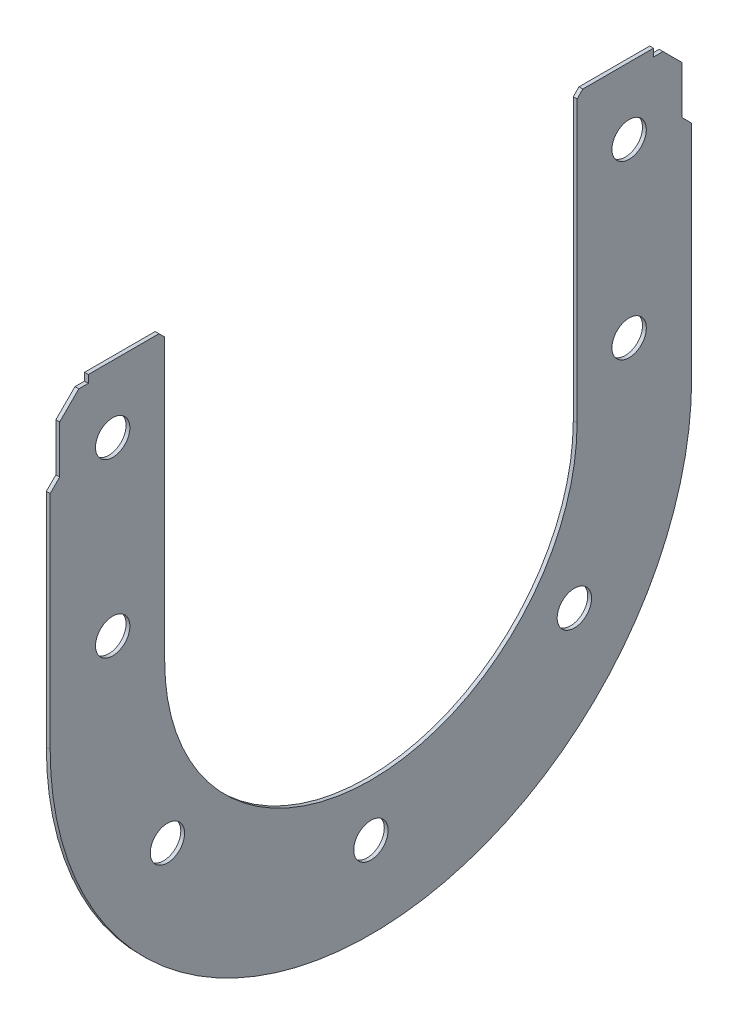
ISO-10303-21;
HEADER;
FILE_DESCRIPTION(('STEP AP214'),'2;1');
FILE_NAME('part.step','',(''),(''),'','','');
FILE_SCHEMA(('AUTOMOTIVE_DESIGN { 1 0 10303 214 1 1 1 1 }'));
ENDSEC;
DATA;
#1=APPLICATION_CONTEXT('core data for automotive mechanical design processes');
#2=APPLICATION_PROTOCOL_DEFINITION('international standard','automotive_design',2000,#1);
#3=PRODUCT_CONTEXT('',#1,'mechanical');
#4=PRODUCT('Part','Part','',(#3));
#5=PRODUCT_RELATED_PRODUCT_CATEGORY('part','',(#4));
#6=PRODUCT_DEFINITION_FORMATION('','',#4);
#7=PRODUCT_DEFINITION_CONTEXT('part definition',#1,'design');
#8=PRODUCT_DEFINITION('design','',#6,#7);
#9=PRODUCT_DEFINITION_SHAPE('','',#8);
#10=(LENGTH_UNIT() NAMED_UNIT(*) SI_UNIT(.MILLI.,.METRE.));
#11=(NAMED_UNIT(*) PLANE_ANGLE_UNIT() SI_UNIT($,.RADIAN.));
#12=(NAMED_UNIT(*) SI_UNIT($,.STERADIAN.) SOLID_ANGLE_UNIT());
#13=UNCERTAINTY_MEASURE_WITH_UNIT(LENGTH_MEASURE(1.E-05),#10,'distance_accuracy_value','');
#14=(GEOMETRIC_REPRESENTATION_CONTEXT(3) GLOBAL_UNCERTAINTY_ASSIGNED_CONTEXT((#13)) GLOBAL_UNIT_ASSIGNED_CONTEXT((#10,
#11,#12)) REPRESENTATION_CONTEXT('',''));
#15=CARTESIAN_POINT('',(0.,0.,0.));
#16=DIRECTION('',(0.,0.,1.));
#17=DIRECTION('',(1.,0.,0.));
#18=AXIS2_PLACEMENT_3D('',#15,#16,#17);
#19=CARTESIAN_POINT('',(-1.,0.,108.));
#20=DIRECTION('',(0.,0.,-1.));
#21=DIRECTION('',(-1.,0.,0.));
#22=AXIS2_PLACEMENT_3D('',#19,#20,#21);
#23=PLANE('',#22);
#24=DIRECTION('',(0.,1.,0.));
#25=VECTOR('',#24,1.);
#26=CARTESIAN_POINT('',(-1.,146.,108.));
#27=LINE('',#26,#25);
#28=CARTESIAN_POINT('',(-1.,0.,108.));
#29=VERTEX_POINT('',#28);
#30=CARTESIAN_POINT('',(-1.,147.,108.));
#31=VERTEX_POINT('',#30);
#32=EDGE_CURVE('E301',#29,#31,#27,.T.);
#33=ORIENTED_EDGE('',*,*,#32,.T.);
#34=DIRECTION('',(1.,0.,0.));
#35=VECTOR('',#34,1.);
#36=CARTESIAN_POINT('',(-1.,147.,108.));
#37=LINE('',#36,#35);
#38=CARTESIAN_POINT('',(1.,147.,108.));
#39=VERTEX_POINT('',#38);
#40=EDGE_CURVE('E59',#31,#39,#37,.T.);
#41=ORIENTED_EDGE('',*,*,#40,.T.);
#42=DIRECTION('',(0.,1.,0.));
#43=VECTOR('',#42,1.);
#44=CARTESIAN_POINT('',(1.,0.,108.));
#45=LINE('',#44,#43);
#46=CARTESIAN_POINT('',(1.,0.,108.));
#47=VERTEX_POINT('',#46);
#48=EDGE_CURVE('E305',#47,#39,#45,.T.);
#49=ORIENTED_EDGE('',*,*,#48,.F.);
#50=DIRECTION('',(1.,0.,0.));
#51=VECTOR('',#50,1.);
#52=CARTESIAN_POINT('',(-1.,0.,108.));
#53=LINE('',#52,#51);
#54=EDGE_CURVE('E386',#29,#47,#53,.T.);
#55=ORIENTED_EDGE('',*,*,#54,.F.);
#56=EDGE_LOOP('',(#33,#41,#49,#55));
#57=FACE_BOUND('',#56,.T.);
#58=ADVANCED_FACE('F49',(#57),#23,.T.);
#59=CARTESIAN_POINT('',(-1.,0.,0.));
#60=DIRECTION('',(1.,0.,0.));
#61=DIRECTION('',(0.,0.,-1.));
#62=AXIS2_PLACEMENT_3D('',#59,#60,#61);
#63=CYLINDRICAL_SURFACE('',#62,108.);
#64=CARTESIAN_POINT('',(1.,0.,0.));
#65=DIRECTION('',(-1.,0.,0.));
#66=DIRECTION('',(0.,0.,-1.));
#67=AXIS2_PLACEMENT_3D('',#64,#65,#66);
#68=CIRCLE('',#67,108.);
#69=CARTESIAN_POINT('',(1.,0.,-108.));
#70=VERTEX_POINT('',#69);
#71=EDGE_CURVE('E379',#70,#47,#68,.T.);
#72=ORIENTED_EDGE('',*,*,#71,.F.);
#73=DIRECTION('',(1.,0.,0.));
#74=VECTOR('',#73,1.);
#75=CARTESIAN_POINT('',(-1.,0.,-108.));
#76=LINE('',#75,#74);
#77=CARTESIAN_POINT('',(-1.,0.,-108.));
#78=VERTEX_POINT('',#77);
#79=EDGE_CURVE('E390',#78,#70,#76,.T.);
#80=ORIENTED_EDGE('',*,*,#79,.F.);
#81=CARTESIAN_POINT('',(-1.,0.,0.));
#82=DIRECTION('',(-1.,0.,0.));
#83=DIRECTION('',(0.,0.,-1.));
#84=AXIS2_PLACEMENT_3D('',#81,#82,#83);
#85=CIRCLE('',#84,108.);
#86=EDGE_CURVE('E341',#78,#29,#85,.T.);
#87=ORIENTED_EDGE('',*,*,#86,.T.);
#88=ORIENTED_EDGE('',*,*,#54,.T.);
#89=EDGE_LOOP('',(#72,#80,#87,#88));
#90=FACE_BOUND('',#89,.T.);
#91=ADVANCED_FACE('F466',(#90),#63,.F.);
#92=CARTESIAN_POINT('',(-1.,0.,-108.));
#93=DIRECTION('',(0.,0.,1.));
#94=DIRECTION('',(1.,0.,0.));
#95=AXIS2_PLACEMENT_3D('',#92,#93,#94);
#96=PLANE('',#95);
#97=DIRECTION('',(0.,-1.,0.));
#98=VECTOR('',#97,1.);
#99=CARTESIAN_POINT('',(1.,0.,-108.));
#100=LINE('',#99,#98);
#101=CARTESIAN_POINT('',(1.,147.,-108.));
#102=VERTEX_POINT('',#101);
#103=EDGE_CURVE('E376',#102,#70,#100,.T.);
#104=ORIENTED_EDGE('',*,*,#103,.F.);
#105=DIRECTION('',(-1.,0.,0.));
#106=VECTOR('',#105,1.);
#107=CARTESIAN_POINT('',(-1.,147.,-108.));
#108=LINE('',#107,#106);
#109=CARTESIAN_POINT('',(-1.,147.,-108.));
#110=VERTEX_POINT('',#109);
#111=EDGE_CURVE('E448',#102,#110,#108,.T.);
#112=ORIENTED_EDGE('',*,*,#111,.T.);
#113=DIRECTION('',(0.,-1.,0.));
#114=VECTOR('',#113,1.);
#115=CARTESIAN_POINT('',(-1.,146.,-108.));
#116=LINE('',#115,#114);
#117=EDGE_CURVE('E338',#110,#78,#116,.T.);
#118=ORIENTED_EDGE('',*,*,#117,.T.);
#119=ORIENTED_EDGE('',*,*,#79,.T.);
#120=EDGE_LOOP('',(#104,#112,#118,#119));
#121=FACE_BOUND('',#120,.T.);
#122=ADVANCED_FACE('F538',(#121),#96,.T.);
#123=CARTESIAN_POINT('',(-1.,150.,-108.));
#124=DIRECTION('',(0.,1.,0.));
#125=DIRECTION('',(0.,0.,1.));
#126=AXIS2_PLACEMENT_3D('',#123,#124,#125);
#127=PLANE('',#126);
#128=DIRECTION('',(0.,0.,1.));
#129=VECTOR('',#128,1.);
#130=CARTESIAN_POINT('',(-1.,150.,-108.));
#131=LINE('',#130,#129);
#132=CARTESIAN_POINT('',(-1.,150.,-148.));
#133=VERTEX_POINT('',#132);
#134=CARTESIAN_POINT('',(-1.,150.,-111.));
#135=VERTEX_POINT('',#134);
#136=EDGE_CURVE('E334',#133,#135,#131,.T.);
#137=ORIENTED_EDGE('',*,*,#136,.T.);
#138=DIRECTION('',(1.,0.,0.));
#139=VECTOR('',#138,1.);
#140=CARTESIAN_POINT('',(-1.,150.,-111.));
#141=LINE('',#140,#139);
#142=CARTESIAN_POINT('',(1.,150.,-111.));
#143=VERTEX_POINT('',#142);
#144=EDGE_CURVE('E438',#135,#143,#141,.T.);
#145=ORIENTED_EDGE('',*,*,#144,.T.);
#146=DIRECTION('',(0.,0.,1.));
#147=VECTOR('',#146,1.);
#148=CARTESIAN_POINT('',(1.,150.,-108.));
#149=LINE('',#148,#147);
#150=CARTESIAN_POINT('',(1.,150.,-148.));
#151=VERTEX_POINT('',#150);
#152=EDGE_CURVE('E373',#151,#143,#149,.T.);
#153=ORIENTED_EDGE('',*,*,#152,.F.);
#154=DIRECTION('',(1.,0.,0.));
#155=VECTOR('',#154,1.);
#156=CARTESIAN_POINT('',(-1.,150.,-148.));
#157=LINE('',#156,#155);
#158=EDGE_CURVE('E394',#133,#151,#157,.T.);
#159=ORIENTED_EDGE('',*,*,#158,.F.);
#160=EDGE_LOOP('',(#137,#145,#153,#159));
#161=FACE_BOUND('',#160,.T.);
#162=ADVANCED_FACE('F479',(#161),#127,.T.);
#163=CARTESIAN_POINT('',(-1.,150.,-148.));
#164=DIRECTION('',(0.,0.,-1.));
#165=DIRECTION('',(-1.,0.,0.));
#166=AXIS2_PLACEMENT_3D('',#163,#164,#165);
#167=PLANE('',#166);
#168=DIRECTION('',(0.,1.,0.));
#169=VECTOR('',#168,1.);
#170=CARTESIAN_POINT('',(1.,150.,-148.));
#171=LINE('',#170,#169);
#172=CARTESIAN_POINT('',(1.,146.,-148.));
#173=VERTEX_POINT('',#172);
#174=EDGE_CURVE('E369',#173,#151,#171,.T.);
#175=ORIENTED_EDGE('',*,*,#174,.F.);
#176=DIRECTION('',(1.,0.,0.));
#177=VECTOR('',#176,1.);
#178=CARTESIAN_POINT('',(-1.,146.,-148.));
#179=LINE('',#178,#177);
#180=CARTESIAN_POINT('',(-1.,146.,-148.));
#181=VERTEX_POINT('',#180);
#182=EDGE_CURVE('E397',#181,#173,#179,.T.);
#183=ORIENTED_EDGE('',*,*,#182,.F.);
#184=DIRECTION('',(0.,1.,0.));
#185=VECTOR('',#184,1.);
#186=CARTESIAN_POINT('',(-1.,150.,-148.));
#187=LINE('',#186,#185);
#188=EDGE_CURVE('E330',#181,#133,#187,.T.);
#189=ORIENTED_EDGE('',*,*,#188,.T.);
#190=ORIENTED_EDGE('',*,*,#158,.T.);
#191=EDGE_LOOP('',(#175,#183,#189,#190));
#192=FACE_BOUND('',#191,.T.);
#193=ADVANCED_FACE('F484',(#192),#167,.T.);
#194=CARTESIAN_POINT('',(-1.,146.,-148.));
#195=DIRECTION('',(0.,1.,0.));
#196=DIRECTION('',(0.,0.,1.));
#197=AXIS2_PLACEMENT_3D('',#194,#195,#196);
#198=PLANE('',#197);
#199=DIRECTION('',(0.,0.,1.));
#200=VECTOR('',#199,1.);
#201=CARTESIAN_POINT('',(1.,146.,-148.));
#202=LINE('',#201,#200);
#203=CARTESIAN_POINT('',(1.,146.,-153.));
#204=VERTEX_POINT('',#203);
#205=EDGE_CURVE('E366',#204,#173,#202,.T.);
#206=ORIENTED_EDGE('',*,*,#205,.F.);
#207=DIRECTION('',(-1.,0.,0.));
#208=VECTOR('',#207,1.);
#209=CARTESIAN_POINT('',(-1.,146.,-153.));
#210=LINE('',#209,#208);
#211=CARTESIAN_POINT('',(-1.,146.,-153.));
#212=VERTEX_POINT('',#211);
#213=EDGE_CURVE('E422',#204,#212,#210,.T.);
#214=ORIENTED_EDGE('',*,*,#213,.T.);
#215=DIRECTION('',(0.,0.,1.));
#216=VECTOR('',#215,1.);
#217=CARTESIAN_POINT('',(-1.,146.,-148.));
#218=LINE('',#217,#216);
#219=EDGE_CURVE('E327',#212,#181,#218,.T.);
#220=ORIENTED_EDGE('',*,*,#219,.T.);
#221=ORIENTED_EDGE('',*,*,#182,.T.);
#222=EDGE_LOOP('',(#206,#214,#220,#221));
#223=FACE_BOUND('',#222,.T.);
#224=ADVANCED_FACE('F548',(#223),#198,.T.);
#225=CARTESIAN_POINT('',(-1.,146.,-168.));
#226=DIRECTION('',(0.,0.,-1.));
#227=DIRECTION('',(0.,1.,0.));
#228=AXIS2_PLACEMENT_3D('',#225,#226,#227);
#229=PLANE('',#228);
#230=DIRECTION('',(1.,0.,0.));
#231=VECTOR('',#230,1.);
#232=CARTESIAN_POINT('',(-1.,106.,-168.));
#233=LINE('',#232,#231);
#234=CARTESIAN_POINT('',(-1.,106.,-168.));
#235=VERTEX_POINT('',#234);
#236=CARTESIAN_POINT('',(1.,106.,-168.));
#237=VERTEX_POINT('',#236);
#238=EDGE_CURVE('E230',#235,#237,#233,.T.);
#239=ORIENTED_EDGE('',*,*,#238,.T.);
#240=DIRECTION('',(0.,1.,0.));
#241=VECTOR('',#240,1.);
#242=CARTESIAN_POINT('',(1.,146.,-168.));
#243=LINE('',#242,#241);
#244=CARTESIAN_POINT('',(1.,-10.,-168.));
#245=VERTEX_POINT('',#244);
#246=EDGE_CURVE('E362',#245,#237,#243,.T.);
#247=ORIENTED_EDGE('',*,*,#246,.F.);
#248=DIRECTION('',(1.,0.,0.));
#249=VECTOR('',#248,1.);
#250=CARTESIAN_POINT('',(-1.,-10.,-168.));
#251=LINE('',#250,#249);
#252=CARTESIAN_POINT('',(-1.,-10.,-168.));
#253=VERTEX_POINT('',#252);
#254=EDGE_CURVE('E401',#253,#245,#251,.T.);
#255=ORIENTED_EDGE('',*,*,#254,.F.);
#256=DIRECTION('',(0.,1.,0.));
#257=VECTOR('',#256,1.);
#258=CARTESIAN_POINT('',(-1.,146.,-168.));
#259=LINE('',#258,#257);
#260=EDGE_CURVE('E323',#253,#235,#259,.T.);
#261=ORIENTED_EDGE('',*,*,#260,.T.);
#262=EDGE_LOOP('',(#239,#247,#255,#261));
#263=FACE_BOUND('',#262,.T.);
#264=ADVANCED_FACE('F504',(#263),#229,.T.);
#265=CARTESIAN_POINT('',(-1.,-9.99999999999998,0.));
#266=DIRECTION('',(1.,0.,0.));
#267=DIRECTION('',(0.,0.,-1.));
#268=AXIS2_PLACEMENT_3D('',#265,#266,#267);
#269=CYLINDRICAL_SURFACE('',#268,168.);
#270=CARTESIAN_POINT('',(1.,-9.99999999999998,0.));
#271=DIRECTION('',(1.,0.,0.));
#272=DIRECTION('',(0.,0.,-1.));
#273=AXIS2_PLACEMENT_3D('',#270,#271,#272);
#274=CIRCLE('',#273,168.);
#275=CARTESIAN_POINT('',(1.,-9.99999999999996,168.));
#276=VERTEX_POINT('',#275);
#277=EDGE_CURVE('E358',#276,#245,#274,.T.);
#278=ORIENTED_EDGE('',*,*,#277,.F.);
#279=DIRECTION('',(1.,0.,0.));
#280=VECTOR('',#279,1.);
#281=CARTESIAN_POINT('',(-1.,-9.99999999999996,168.));
#282=LINE('',#281,#280);
#283=CARTESIAN_POINT('',(-1.,-9.99999999999996,168.));
#284=VERTEX_POINT('',#283);
#285=EDGE_CURVE('E404',#284,#276,#282,.T.);
#286=ORIENTED_EDGE('',*,*,#285,.F.);
#287=CARTESIAN_POINT('',(-1.,-9.99999999999998,0.));
#288=DIRECTION('',(1.,0.,0.));
#289=DIRECTION('',(0.,0.,-1.));
#290=AXIS2_PLACEMENT_3D('',#287,#288,#289);
#291=CIRCLE('',#290,168.);
#292=EDGE_CURVE('E319',#284,#253,#291,.T.);
#293=ORIENTED_EDGE('',*,*,#292,.T.);
#294=ORIENTED_EDGE('',*,*,#254,.T.);
#295=EDGE_LOOP('',(#278,#286,#293,#294));
#296=FACE_BOUND('',#295,.T.);
#297=ADVANCED_FACE('F511',(#296),#269,.T.);
#298=CARTESIAN_POINT('',(-1.,146.,168.));
#299=DIRECTION('',(0.,0.,1.));
#300=DIRECTION('',(0.,-1.,0.));
#301=AXIS2_PLACEMENT_3D('',#298,#299,#300);
#302=PLANE('',#301);
#303=DIRECTION('',(1.,0.,0.));
#304=VECTOR('',#303,1.);
#305=CARTESIAN_POINT('',(-1.,106.,168.));
#306=LINE('',#305,#304);
#307=CARTESIAN_POINT('',(-1.,106.,168.));
#308=VERTEX_POINT('',#307);
#309=CARTESIAN_POINT('',(1.,106.,168.));
#310=VERTEX_POINT('',#309);
#311=EDGE_CURVE('E199',#308,#310,#306,.T.);
#312=ORIENTED_EDGE('',*,*,#311,.F.);
#313=DIRECTION('',(0.,-1.,0.));
#314=VECTOR('',#313,1.);
#315=CARTESIAN_POINT('',(-1.,146.,168.));
#316=LINE('',#315,#314);
#317=EDGE_CURVE('E316',#308,#284,#316,.T.);
#318=ORIENTED_EDGE('',*,*,#317,.T.);
#319=ORIENTED_EDGE('',*,*,#285,.T.);
#320=DIRECTION('',(0.,-1.,0.));
#321=VECTOR('',#320,1.);
#322=CARTESIAN_POINT('',(1.,146.,168.));
#323=LINE('',#322,#321);
#324=EDGE_CURVE('E355',#310,#276,#323,.T.);
#325=ORIENTED_EDGE('',*,*,#324,.F.);
#326=EDGE_LOOP('',(#312,#318,#319,#325));
#327=FACE_BOUND('',#326,.T.);
#328=ADVANCED_FACE('F513',(#327),#302,.T.);
#329=CARTESIAN_POINT('',(-1.,146.,168.));
#330=DIRECTION('',(0.,1.,0.));
#331=DIRECTION('',(0.,0.,1.));
#332=AXIS2_PLACEMENT_3D('',#329,#330,#331);
#333=PLANE('',#332);
#334=DIRECTION('',(0.,0.,1.));
#335=VECTOR('',#334,1.);
#336=CARTESIAN_POINT('',(-1.,146.,168.));
#337=LINE('',#336,#335);
#338=CARTESIAN_POINT('',(-1.,146.,148.));
#339=VERTEX_POINT('',#338);
#340=CARTESIAN_POINT('',(-1.,146.,153.));
#341=VERTEX_POINT('',#340);
#342=EDGE_CURVE('E312',#339,#341,#337,.T.);
#343=ORIENTED_EDGE('',*,*,#342,.T.);
#344=DIRECTION('',(1.,0.,0.));
#345=VECTOR('',#344,1.);
#346=CARTESIAN_POINT('',(1.,146.,153.));
#347=LINE('',#346,#345);
#348=CARTESIAN_POINT('',(1.,146.,153.));
#349=VERTEX_POINT('',#348);
#350=EDGE_CURVE('E431',#341,#349,#347,.T.);
#351=ORIENTED_EDGE('',*,*,#350,.T.);
#352=DIRECTION('',(0.,0.,1.));
#353=VECTOR('',#352,1.);
#354=CARTESIAN_POINT('',(1.,146.,168.));
#355=LINE('',#354,#353);
#356=CARTESIAN_POINT('',(1.,146.,148.));
#357=VERTEX_POINT('',#356);
#358=EDGE_CURVE('E352',#357,#349,#355,.T.);
#359=ORIENTED_EDGE('',*,*,#358,.F.);
#360=DIRECTION('',(1.,0.,0.));
#361=VECTOR('',#360,1.);
#362=CARTESIAN_POINT('',(-1.,146.,148.));
#363=LINE('',#362,#361);
#364=EDGE_CURVE('E408',#339,#357,#363,.T.);
#365=ORIENTED_EDGE('',*,*,#364,.F.);
#366=EDGE_LOOP('',(#343,#351,#359,#365));
#367=FACE_BOUND('',#366,.T.);
#368=ADVANCED_FACE('F521',(#367),#333,.T.);
#369=CARTESIAN_POINT('',(-1.,150.,148.));
#370=DIRECTION('',(0.,0.,1.));
#371=DIRECTION('',(1.,0.,0.));
#372=AXIS2_PLACEMENT_3D('',#369,#370,#371);
#373=PLANE('',#372);
#374=DIRECTION('',(0.,-1.,0.));
#375=VECTOR('',#374,1.);
#376=CARTESIAN_POINT('',(1.,150.,148.));
#377=LINE('',#376,#375);
#378=CARTESIAN_POINT('',(1.,150.,148.));
#379=VERTEX_POINT('',#378);
#380=EDGE_CURVE('E348',#379,#357,#377,.T.);
#381=ORIENTED_EDGE('',*,*,#380,.F.);
#382=DIRECTION('',(1.,0.,0.));
#383=VECTOR('',#382,1.);
#384=CARTESIAN_POINT('',(-1.,150.,148.));
#385=LINE('',#384,#383);
#386=CARTESIAN_POINT('',(-1.,150.,148.));
#387=VERTEX_POINT('',#386);
#388=EDGE_CURVE('E345',#387,#379,#385,.T.);
#389=ORIENTED_EDGE('',*,*,#388,.F.);
#390=DIRECTION('',(0.,-1.,0.));
#391=VECTOR('',#390,1.);
#392=CARTESIAN_POINT('',(-1.,150.,148.));
#393=LINE('',#392,#391);
#394=EDGE_CURVE('E308',#387,#339,#393,.T.);
#395=ORIENTED_EDGE('',*,*,#394,.T.);
#396=ORIENTED_EDGE('',*,*,#364,.T.);
#397=EDGE_LOOP('',(#381,#389,#395,#396));
#398=FACE_BOUND('',#397,.T.);
#399=ADVANCED_FACE('F525',(#398),#373,.T.);
#400=CARTESIAN_POINT('',(-1.,150.,108.));
#401=DIRECTION('',(0.,1.,0.));
#402=DIRECTION('',(0.,0.,1.));
#403=AXIS2_PLACEMENT_3D('',#400,#401,#402);
#404=PLANE('',#403);
#405=DIRECTION('',(0.,0.,1.));
#406=VECTOR('',#405,1.);
#407=CARTESIAN_POINT('',(1.,150.,108.));
#408=LINE('',#407,#406);
#409=CARTESIAN_POINT('',(1.,150.,111.));
#410=VERTEX_POINT('',#409);
#411=EDGE_CURVE('E297',#410,#379,#408,.T.);
#412=ORIENTED_EDGE('',*,*,#411,.F.);
#413=DIRECTION('',(-1.,0.,0.));
#414=VECTOR('',#413,1.);
#415=CARTESIAN_POINT('',(-1.,150.,111.));
#416=LINE('',#415,#414);
#417=CARTESIAN_POINT('',(-1.,150.,111.));
#418=VERTEX_POINT('',#417);
#419=EDGE_CURVE('E11',#410,#418,#416,.T.);
#420=ORIENTED_EDGE('',*,*,#419,.T.);
#421=DIRECTION('',(0.,0.,1.));
#422=VECTOR('',#421,1.);
#423=CARTESIAN_POINT('',(-1.,150.,108.));
#424=LINE('',#423,#422);
#425=EDGE_CURVE('E304',#418,#387,#424,.T.);
#426=ORIENTED_EDGE('',*,*,#425,.T.);
#427=ORIENTED_EDGE('',*,*,#388,.T.);
#428=EDGE_LOOP('',(#412,#420,#426,#427));
#429=FACE_BOUND('',#428,.T.);
#430=ADVANCED_FACE('F561',(#429),#404,.T.);
#431=CARTESIAN_POINT('',(-1.,-9.99999999999998,0.));
#432=DIRECTION('',(1.,0.,0.));
#433=DIRECTION('',(0.,0.,-1.));
#434=AXIS2_PLACEMENT_3D('',#431,#432,#433);
#435=PLANE('',#434);
#436=CARTESIAN_POINT('',(-1.,-83.2682145377946,-106.57845442531));
#437=DIRECTION('',(1.,0.,0.));
#438=DIRECTION('',(0.,0.,-1.));
#439=AXIS2_PLACEMENT_3D('',#436,#437,#438);
#440=CIRCLE('',#439,8.99999999999999);
#441=CARTESIAN_POINT('',(-1.,-83.2682145377946,-115.57845442531));
#442=VERTEX_POINT('',#441);
#443=EDGE_CURVE('E282',#442,#442,#440,.T.);
#444=ORIENTED_EDGE('',*,*,#443,.T.);
#445=EDGE_LOOP('',(#444));
#446=FACE_BOUND('',#445,.T.);
#447=CARTESIAN_POINT('',(-1.,115.,-135.25));
#448=DIRECTION('',(1.,0.,0.));
#449=DIRECTION('',(0.,0.,-1.));
#450=AXIS2_PLACEMENT_3D('',#447,#448,#449);
#451=CIRCLE('',#450,9.00000000000001);
#452=CARTESIAN_POINT('',(-1.,115.,-144.25));
#453=VERTEX_POINT('',#452);
#454=EDGE_CURVE('E275',#453,#453,#451,.T.);
#455=ORIENTED_EDGE('',*,*,#454,.T.);
#456=EDGE_LOOP('',(#455));
#457=FACE_BOUND('',#456,.T.);
#458=CARTESIAN_POINT('',(-1.,25.,-135.25));
#459=DIRECTION('',(1.,0.,0.));
#460=DIRECTION('',(0.,0.,-1.));
#461=AXIS2_PLACEMENT_3D('',#458,#459,#460);
#462=CIRCLE('',#461,9.00000000000001);
#463=CARTESIAN_POINT('',(-1.,25.,-144.25));
#464=VERTEX_POINT('',#463);
#465=EDGE_CURVE('E198',#464,#464,#462,.T.);
#466=ORIENTED_EDGE('',*,*,#465,.T.);
#467=EDGE_LOOP('',(#466));
#468=FACE_BOUND('',#467,.T.);
#469=CARTESIAN_POINT('',(-1.,-83.2682145377947,106.57845442531));
#470=DIRECTION('',(1.,0.,0.));
#471=DIRECTION('',(0.,0.,-1.));
#472=AXIS2_PLACEMENT_3D('',#469,#470,#471);
#473=CIRCLE('',#472,8.99999999999999);
#474=CARTESIAN_POINT('',(-1.,-83.2682145377947,97.5784544253096));
#475=VERTEX_POINT('',#474);
#476=EDGE_CURVE('E266',#475,#475,#473,.T.);
#477=ORIENTED_EDGE('',*,*,#476,.T.);
#478=EDGE_LOOP('',(#477));
#479=FACE_BOUND('',#478,.T.);
#480=CARTESIAN_POINT('',(-1.,-135.25,0.));
#481=DIRECTION('',(1.,0.,0.));
#482=DIRECTION('',(0.,0.,-1.));
#483=AXIS2_PLACEMENT_3D('',#480,#481,#482);
#484=CIRCLE('',#483,9.);
#485=CARTESIAN_POINT('',(-1.,-135.25,-9.));
#486=VERTEX_POINT('',#485);
#487=EDGE_CURVE('E258',#486,#486,#484,.T.);
#488=ORIENTED_EDGE('',*,*,#487,.T.);
#489=EDGE_LOOP('',(#488));
#490=FACE_BOUND('',#489,.T.);
#491=CARTESIAN_POINT('',(-1.,115.,135.25));
#492=DIRECTION('',(1.,0.,0.));
#493=DIRECTION('',(0.,0.,-1.));
#494=AXIS2_PLACEMENT_3D('',#491,#492,#493);
#495=CIRCLE('',#494,9.00000000000001);
#496=CARTESIAN_POINT('',(-1.,115.,126.25));
#497=VERTEX_POINT('',#496);
#498=EDGE_CURVE('E250',#497,#497,#495,.T.);
#499=ORIENTED_EDGE('',*,*,#498,.T.);
#500=EDGE_LOOP('',(#499));
#501=FACE_BOUND('',#500,.T.);
#502=CARTESIAN_POINT('',(-1.,25.,135.25));
#503=DIRECTION('',(1.,0.,0.));
#504=DIRECTION('',(0.,0.,-1.));
#505=AXIS2_PLACEMENT_3D('',#502,#503,#504);
#506=CIRCLE('',#505,9.00000000000001);
#507=CARTESIAN_POINT('',(-1.,25.,126.25));
#508=VERTEX_POINT('',#507);
#509=EDGE_CURVE('E293',#508,#508,#506,.T.);
#510=ORIENTED_EDGE('',*,*,#509,.T.);
#511=EDGE_LOOP('',(#510));
#512=FACE_BOUND('',#511,.T.);
#513=ORIENTED_EDGE('',*,*,#117,.F.);
#514=DIRECTION('',(0.,-0.707106781186548,0.707106781186548));
#515=VECTOR('',#514,1.);
#516=CARTESIAN_POINT('',(-1.,150.,-111.));
#517=LINE('',#516,#515);
#518=EDGE_CURVE('E453',#110,#135,#517,.F.);
#519=ORIENTED_EDGE('',*,*,#518,.T.);
#520=ORIENTED_EDGE('',*,*,#136,.F.);
#521=ORIENTED_EDGE('',*,*,#188,.F.);
#522=ORIENTED_EDGE('',*,*,#219,.F.);
#523=DIRECTION('',(0.,-0.707106781186548,-0.707106781186548));
#524=VECTOR('',#523,1.);
#525=CARTESIAN_POINT('',(-1.,136.,-163.));
#526=LINE('',#525,#524);
#527=CARTESIAN_POINT('',(-1.,136.,-163.));
#528=VERTEX_POINT('',#527);
#529=EDGE_CURVE('E428',#212,#528,#526,.T.);
#530=ORIENTED_EDGE('',*,*,#529,.T.);
#531=DIRECTION('',(0.,-1.,0.));
#532=VECTOR('',#531,1.);
#533=CARTESIAN_POINT('',(-1.,146.,-163.));
#534=LINE('',#533,#532);
#535=CARTESIAN_POINT('',(-1.,111.,-163.));
#536=VERTEX_POINT('',#535);
#537=EDGE_CURVE('E237',#528,#536,#534,.T.);
#538=ORIENTED_EDGE('',*,*,#537,.T.);
#539=DIRECTION('',(0.,-0.707106781186547,-0.707106781186547));
#540=VECTOR('',#539,1.);
#541=CARTESIAN_POINT('',(-1.,111.,-163.));
#542=LINE('',#541,#540);
#543=EDGE_CURVE('E229',#536,#235,#542,.T.);
#544=ORIENTED_EDGE('',*,*,#543,.T.);
#545=ORIENTED_EDGE('',*,*,#260,.F.);
#546=ORIENTED_EDGE('',*,*,#292,.F.);
#547=ORIENTED_EDGE('',*,*,#317,.F.);
#548=DIRECTION('',(0.,0.707106781186547,-0.707106781186547));
#549=VECTOR('',#548,1.);
#550=CARTESIAN_POINT('',(-1.,111.,163.));
#551=LINE('',#550,#549);
#552=CARTESIAN_POINT('',(-1.,111.,163.));
#553=VERTEX_POINT('',#552);
#554=EDGE_CURVE('E216',#308,#553,#551,.T.);
#555=ORIENTED_EDGE('',*,*,#554,.T.);
#556=DIRECTION('',(0.,1.,0.));
#557=VECTOR('',#556,1.);
#558=CARTESIAN_POINT('',(-1.,146.,163.));
#559=LINE('',#558,#557);
#560=CARTESIAN_POINT('',(-1.,136.,163.));
#561=VERTEX_POINT('',#560);
#562=EDGE_CURVE('E194',#553,#561,#559,.T.);
#563=ORIENTED_EDGE('',*,*,#562,.T.);
#564=DIRECTION('',(0.,0.707106781186548,-0.707106781186548));
#565=VECTOR('',#564,1.);
#566=CARTESIAN_POINT('',(-1.,146.,153.));
#567=LINE('',#566,#565);
#568=EDGE_CURVE('E425',#561,#341,#567,.T.);
#569=ORIENTED_EDGE('',*,*,#568,.T.);
#570=ORIENTED_EDGE('',*,*,#342,.F.);
#571=ORIENTED_EDGE('',*,*,#394,.F.);
#572=ORIENTED_EDGE('',*,*,#425,.F.);
#573=DIRECTION('',(0.,0.707106781186548,0.707106781186548));
#574=VECTOR('',#573,1.);
#575=CARTESIAN_POINT('',(-1.,147.,108.));
#576=LINE('',#575,#574);
#577=EDGE_CURVE('E66',#418,#31,#576,.F.);
#578=ORIENTED_EDGE('',*,*,#577,.T.);
#579=ORIENTED_EDGE('',*,*,#32,.F.);
#580=ORIENTED_EDGE('',*,*,#86,.F.);
#581=EDGE_LOOP('',(#513,#519,#520,#521,#522,#530,#538,#544,#545,#546,#547,#555,#563,#569,#570,
#571,#572,#578,#579,#580));
#582=FACE_BOUND('',#581,.T.);
#583=ADVANCED_FACE('F469',(#446,#457,#468,#479,#490,#501,#512,#582),#435,.F.);
#584=CARTESIAN_POINT('',(1.,-9.99999999999998,0.));
#585=DIRECTION('',(1.,0.,0.));
#586=DIRECTION('',(0.,0.,-1.));
#587=AXIS2_PLACEMENT_3D('',#584,#585,#586);
#588=PLANE('',#587);
#589=ORIENTED_EDGE('',*,*,#152,.T.);
#590=DIRECTION('',(0.,0.707106781186548,-0.707106781186548));
#591=VECTOR('',#590,1.);
#592=CARTESIAN_POINT('',(1.,14.5,24.5));
#593=LINE('',#592,#591);
#594=EDGE_CURVE('E445',#143,#102,#593,.F.);
#595=ORIENTED_EDGE('',*,*,#594,.T.);
#596=ORIENTED_EDGE('',*,*,#103,.T.);
#597=ORIENTED_EDGE('',*,*,#71,.T.);
#598=ORIENTED_EDGE('',*,*,#48,.T.);
#599=DIRECTION('',(0.,-0.707106781186548,-0.707106781186548));
#600=VECTOR('',#599,1.);
#601=CARTESIAN_POINT('',(1.,14.5,-24.5));
#602=LINE('',#601,#600);
#603=EDGE_CURVE('E442',#39,#410,#602,.F.);
#604=ORIENTED_EDGE('',*,*,#603,.T.);
#605=ORIENTED_EDGE('',*,*,#411,.T.);
#606=ORIENTED_EDGE('',*,*,#380,.T.);
#607=ORIENTED_EDGE('',*,*,#358,.T.);
#608=DIRECTION('',(0.,-0.707106781186548,0.707106781186548));
#609=VECTOR('',#608,1.);
#610=CARTESIAN_POINT('',(1.,144.5,154.5));
#611=LINE('',#610,#609);
#612=CARTESIAN_POINT('',(1.,136.,163.));
#613=VERTEX_POINT('',#612);
#614=EDGE_CURVE('E214',#349,#613,#611,.T.);
#615=ORIENTED_EDGE('',*,*,#614,.T.);
#616=DIRECTION('',(0.,1.,0.));
#617=VECTOR('',#616,1.);
#618=CARTESIAN_POINT('',(1.,146.,163.));
#619=LINE('',#618,#617);
#620=CARTESIAN_POINT('',(1.,111.,163.));
#621=VERTEX_POINT('',#620);
#622=EDGE_CURVE('E191',#621,#613,#619,.T.);
#623=ORIENTED_EDGE('',*,*,#622,.F.);
#624=DIRECTION('',(0.,0.707106781186547,-0.707106781186547));
#625=VECTOR('',#624,1.);
#626=CARTESIAN_POINT('',(1.,111.,163.));
#627=LINE('',#626,#625);
#628=EDGE_CURVE('E202',#310,#621,#627,.T.);
#629=ORIENTED_EDGE('',*,*,#628,.F.);
#630=ORIENTED_EDGE('',*,*,#324,.T.);
#631=ORIENTED_EDGE('',*,*,#277,.T.);
#632=ORIENTED_EDGE('',*,*,#246,.T.);
#633=DIRECTION('',(0.,-0.707106781186547,-0.707106781186547));
#634=VECTOR('',#633,1.);
#635=CARTESIAN_POINT('',(1.,111.,-163.));
#636=LINE('',#635,#634);
#637=CARTESIAN_POINT('',(1.,111.,-163.));
#638=VERTEX_POINT('',#637);
#639=EDGE_CURVE('E240',#638,#237,#636,.T.);
#640=ORIENTED_EDGE('',*,*,#639,.F.);
#641=DIRECTION('',(0.,-1.,0.));
#642=VECTOR('',#641,1.);
#643=CARTESIAN_POINT('',(1.,146.,-163.));
#644=LINE('',#643,#642);
#645=CARTESIAN_POINT('',(1.,136.,-163.));
#646=VERTEX_POINT('',#645);
#647=EDGE_CURVE('E208',#646,#638,#644,.T.);
#648=ORIENTED_EDGE('',*,*,#647,.F.);
#649=DIRECTION('',(0.,0.707106781186548,0.707106781186548));
#650=VECTOR('',#649,1.);
#651=CARTESIAN_POINT('',(1.,144.5,-154.5));
#652=LINE('',#651,#650);
#653=EDGE_CURVE('E419',#646,#204,#652,.T.);
#654=ORIENTED_EDGE('',*,*,#653,.T.);
#655=ORIENTED_EDGE('',*,*,#205,.T.);
#656=ORIENTED_EDGE('',*,*,#174,.T.);
#657=EDGE_LOOP('',(#589,#595,#596,#597,#598,#604,#605,#606,#607,#615,#623,#629,#630,#631,#632,
#640,#648,#654,#655,#656));
#658=FACE_BOUND('',#657,.T.);
#659=CARTESIAN_POINT('',(1.,-83.2682145377946,-106.57845442531));
#660=DIRECTION('',(1.,0.,0.));
#661=DIRECTION('',(0.,0.,-1.));
#662=AXIS2_PLACEMENT_3D('',#659,#660,#661);
#663=CIRCLE('',#662,8.99999999999999);
#664=CARTESIAN_POINT('',(1.,-83.2682145377946,-115.57845442531));
#665=VERTEX_POINT('',#664);
#666=EDGE_CURVE('E270',#665,#665,#663,.T.);
#667=ORIENTED_EDGE('',*,*,#666,.F.);
#668=EDGE_LOOP('',(#667));
#669=FACE_BOUND('',#668,.T.);
#670=CARTESIAN_POINT('',(1.,115.,-135.25));
#671=DIRECTION('',(1.,0.,0.));
#672=DIRECTION('',(0.,0.,-1.));
#673=AXIS2_PLACEMENT_3D('',#670,#671,#672);
#674=CIRCLE('',#673,9.00000000000001);
#675=CARTESIAN_POINT('',(1.,115.,-144.25));
#676=VERTEX_POINT('',#675);
#677=EDGE_CURVE('E286',#676,#676,#674,.T.);
#678=ORIENTED_EDGE('',*,*,#677,.F.);
#679=EDGE_LOOP('',(#678));
#680=FACE_BOUND('',#679,.T.);
#681=CARTESIAN_POINT('',(1.,25.,-135.25));
#682=DIRECTION('',(1.,0.,0.));
#683=DIRECTION('',(0.,0.,-1.));
#684=AXIS2_PLACEMENT_3D('',#681,#682,#683);
#685=CIRCLE('',#684,9.00000000000001);
#686=CARTESIAN_POINT('',(1.,25.,-144.25));
#687=VERTEX_POINT('',#686);
#688=EDGE_CURVE('E271',#687,#687,#685,.T.);
#689=ORIENTED_EDGE('',*,*,#688,.F.);
#690=EDGE_LOOP('',(#689));
#691=FACE_BOUND('',#690,.T.);
#692=CARTESIAN_POINT('',(1.,-83.2682145377947,106.57845442531));
#693=DIRECTION('',(1.,0.,0.));
#694=DIRECTION('',(0.,0.,-1.));
#695=AXIS2_PLACEMENT_3D('',#692,#693,#694);
#696=CIRCLE('',#695,8.99999999999999);
#697=CARTESIAN_POINT('',(1.,-83.2682145377947,97.5784544253096));
#698=VERTEX_POINT('',#697);
#699=EDGE_CURVE('E262',#698,#698,#696,.T.);
#700=ORIENTED_EDGE('',*,*,#699,.F.);
#701=EDGE_LOOP('',(#700));
#702=FACE_BOUND('',#701,.T.);
#703=CARTESIAN_POINT('',(1.,-135.25,0.));
#704=DIRECTION('',(1.,0.,0.));
#705=DIRECTION('',(0.,0.,-1.));
#706=AXIS2_PLACEMENT_3D('',#703,#704,#705);
#707=CIRCLE('',#706,9.);
#708=CARTESIAN_POINT('',(1.,-135.25,-9.));
#709=VERTEX_POINT('',#708);
#710=EDGE_CURVE('E254',#709,#709,#707,.T.);
#711=ORIENTED_EDGE('',*,*,#710,.F.);
#712=EDGE_LOOP('',(#711));
#713=FACE_BOUND('',#712,.T.);
#714=CARTESIAN_POINT('',(1.,115.,135.25));
#715=DIRECTION('',(1.,0.,0.));
#716=DIRECTION('',(0.,0.,-1.));
#717=AXIS2_PLACEMENT_3D('',#714,#715,#716);
#718=CIRCLE('',#717,9.00000000000001);
#719=CARTESIAN_POINT('',(1.,115.,126.25));
#720=VERTEX_POINT('',#719);
#721=EDGE_CURVE('E245',#720,#720,#718,.T.);
#722=ORIENTED_EDGE('',*,*,#721,.F.);
#723=EDGE_LOOP('',(#722));
#724=FACE_BOUND('',#723,.T.);
#725=CARTESIAN_POINT('',(1.,25.,135.25));
#726=DIRECTION('',(1.,0.,0.));
#727=DIRECTION('',(0.,0.,-1.));
#728=AXIS2_PLACEMENT_3D('',#725,#726,#727);
#729=CIRCLE('',#728,9.00000000000001);
#730=CARTESIAN_POINT('',(1.,25.,126.25));
#731=VERTEX_POINT('',#730);
#732=EDGE_CURVE('E249',#731,#731,#729,.T.);
#733=ORIENTED_EDGE('',*,*,#732,.F.);
#734=EDGE_LOOP('',(#733));
#735=FACE_BOUND('',#734,.T.);
#736=ADVANCED_FACE('F211',(#658,#669,#680,#691,#702,#713,#724,#735),#588,.T.);
#737=CARTESIAN_POINT('',(-1.,25.,135.25));
#738=DIRECTION('',(1.,0.,0.));
#739=DIRECTION('',(0.,0.,-1.));
#740=AXIS2_PLACEMENT_3D('',#737,#738,#739);
#741=CYLINDRICAL_SURFACE('',#740,9.00000000000001);
#742=ORIENTED_EDGE('',*,*,#509,.F.);
#743=EDGE_LOOP('',(#742));
#744=FACE_BOUND('',#743,.T.);
#745=ORIENTED_EDGE('',*,*,#732,.T.);
#746=EDGE_LOOP('',(#745));
#747=FACE_BOUND('',#746,.T.);
#748=ADVANCED_FACE('F689',(#744,#747),#741,.F.);
#749=CARTESIAN_POINT('',(-1.,115.,135.25));
#750=DIRECTION('',(1.,0.,0.));
#751=DIRECTION('',(0.,0.,-1.));
#752=AXIS2_PLACEMENT_3D('',#749,#750,#751);
#753=CYLINDRICAL_SURFACE('',#752,9.00000000000001);
#754=ORIENTED_EDGE('',*,*,#498,.F.);
#755=EDGE_LOOP('',(#754));
#756=FACE_BOUND('',#755,.T.);
#757=ORIENTED_EDGE('',*,*,#721,.T.);
#758=EDGE_LOOP('',(#757));
#759=FACE_BOUND('',#758,.T.);
#760=ADVANCED_FACE('F680',(#756,#759),#753,.F.);
#761=CARTESIAN_POINT('',(-1.,-135.25,0.));
#762=DIRECTION('',(1.,0.,0.));
#763=DIRECTION('',(0.,0.,-1.));
#764=AXIS2_PLACEMENT_3D('',#761,#762,#763);
#765=CYLINDRICAL_SURFACE('',#764,9.);
#766=ORIENTED_EDGE('',*,*,#487,.F.);
#767=EDGE_LOOP('',(#766));
#768=FACE_BOUND('',#767,.T.);
#769=ORIENTED_EDGE('',*,*,#710,.T.);
#770=EDGE_LOOP('',(#769));
#771=FACE_BOUND('',#770,.T.);
#772=ADVANCED_FACE('F671',(#768,#771),#765,.F.);
#773=CARTESIAN_POINT('',(-1.,-83.2682145377947,106.57845442531));
#774=DIRECTION('',(1.,0.,0.));
#775=DIRECTION('',(0.,0.,-1.));
#776=AXIS2_PLACEMENT_3D('',#773,#774,#775);
#777=CYLINDRICAL_SURFACE('',#776,8.99999999999999);
#778=ORIENTED_EDGE('',*,*,#476,.F.);
#779=EDGE_LOOP('',(#778));
#780=FACE_BOUND('',#779,.T.);
#781=ORIENTED_EDGE('',*,*,#699,.T.);
#782=EDGE_LOOP('',(#781));
#783=FACE_BOUND('',#782,.T.);
#784=ADVANCED_FACE('F662',(#780,#783),#777,.F.);
#785=CARTESIAN_POINT('',(-1.,25.,-135.25));
#786=DIRECTION('',(1.,0.,0.));
#787=DIRECTION('',(0.,0.,-1.));
#788=AXIS2_PLACEMENT_3D('',#785,#786,#787);
#789=CYLINDRICAL_SURFACE('',#788,9.00000000000001);
#790=ORIENTED_EDGE('',*,*,#465,.F.);
#791=EDGE_LOOP('',(#790));
#792=FACE_BOUND('',#791,.T.);
#793=ORIENTED_EDGE('',*,*,#688,.T.);
#794=EDGE_LOOP('',(#793));
#795=FACE_BOUND('',#794,.T.);
#796=ADVANCED_FACE('F653',(#792,#795),#789,.F.);
#797=CARTESIAN_POINT('',(-1.,115.,-135.25));
#798=DIRECTION('',(1.,0.,0.));
#799=DIRECTION('',(0.,0.,-1.));
#800=AXIS2_PLACEMENT_3D('',#797,#798,#799);
#801=CYLINDRICAL_SURFACE('',#800,9.00000000000001);
#802=ORIENTED_EDGE('',*,*,#454,.F.);
#803=EDGE_LOOP('',(#802));
#804=FACE_BOUND('',#803,.T.);
#805=ORIENTED_EDGE('',*,*,#677,.T.);
#806=EDGE_LOOP('',(#805));
#807=FACE_BOUND('',#806,.T.);
#808=ADVANCED_FACE('F644',(#804,#807),#801,.F.);
#809=CARTESIAN_POINT('',(-1.,-83.2682145377946,-106.57845442531));
#810=DIRECTION('',(1.,0.,0.));
#811=DIRECTION('',(0.,0.,-1.));
#812=AXIS2_PLACEMENT_3D('',#809,#810,#811);
#813=CYLINDRICAL_SURFACE('',#812,8.99999999999999);
#814=ORIENTED_EDGE('',*,*,#443,.F.);
#815=EDGE_LOOP('',(#814));
#816=FACE_BOUND('',#815,.T.);
#817=ORIENTED_EDGE('',*,*,#666,.T.);
#818=EDGE_LOOP('',(#817));
#819=FACE_BOUND('',#818,.T.);
#820=ADVANCED_FACE('F626',(#816,#819),#813,.F.);
#821=CARTESIAN_POINT('',(-1.,111.,-163.));
#822=DIRECTION('',(0.,-0.707106781186547,0.707106781186547));
#823=DIRECTION('',(0.,-0.707106781186548,-0.707106781186548));
#824=AXIS2_PLACEMENT_3D('',#821,#822,#823);
#825=PLANE('',#824);
#826=ORIENTED_EDGE('',*,*,#238,.F.);
#827=ORIENTED_EDGE('',*,*,#543,.F.);
#828=DIRECTION('',(1.,0.,0.));
#829=VECTOR('',#828,1.);
#830=CARTESIAN_POINT('',(-1.,111.,-163.));
#831=LINE('',#830,#829);
#832=EDGE_CURVE('E225',#536,#638,#831,.T.);
#833=ORIENTED_EDGE('',*,*,#832,.T.);
#834=ORIENTED_EDGE('',*,*,#639,.T.);
#835=EDGE_LOOP('',(#826,#827,#833,#834));
#836=FACE_BOUND('',#835,.T.);
#837=ADVANCED_FACE('F501',(#836),#825,.F.);
#838=CARTESIAN_POINT('',(-1.,146.,-163.));
#839=DIRECTION('',(0.,0.,1.));
#840=DIRECTION('',(1.,0.,0.));
#841=AXIS2_PLACEMENT_3D('',#838,#839,#840);
#842=PLANE('',#841);
#843=ORIENTED_EDGE('',*,*,#537,.F.);
#844=DIRECTION('',(1.,0.,0.));
#845=VECTOR('',#844,1.);
#846=CARTESIAN_POINT('',(1.,136.,-163.));
#847=LINE('',#846,#845);
#848=EDGE_CURVE('E389',#528,#646,#847,.T.);
#849=ORIENTED_EDGE('',*,*,#848,.T.);
#850=ORIENTED_EDGE('',*,*,#647,.T.);
#851=ORIENTED_EDGE('',*,*,#832,.F.);
#852=EDGE_LOOP('',(#843,#849,#850,#851));
#853=FACE_BOUND('',#852,.T.);
#854=ADVANCED_FACE('F496',(#853),#842,.F.);
#855=CARTESIAN_POINT('',(-1.,146.,163.));
#856=DIRECTION('',(0.,0.,-1.));
#857=DIRECTION('',(-1.,0.,0.));
#858=AXIS2_PLACEMENT_3D('',#855,#856,#857);
#859=PLANE('',#858);
#860=ORIENTED_EDGE('',*,*,#622,.T.);
#861=DIRECTION('',(-1.,0.,0.));
#862=VECTOR('',#861,1.);
#863=CARTESIAN_POINT('',(-1.,136.,163.));
#864=LINE('',#863,#862);
#865=EDGE_CURVE('E435',#613,#561,#864,.T.);
#866=ORIENTED_EDGE('',*,*,#865,.T.);
#867=ORIENTED_EDGE('',*,*,#562,.F.);
#868=DIRECTION('',(1.,0.,0.));
#869=VECTOR('',#868,1.);
#870=CARTESIAN_POINT('',(-1.,111.,163.));
#871=LINE('',#870,#869);
#872=EDGE_CURVE('E187',#553,#621,#871,.T.);
#873=ORIENTED_EDGE('',*,*,#872,.T.);
#874=EDGE_LOOP('',(#860,#866,#867,#873));
#875=FACE_BOUND('',#874,.T.);
#876=ADVANCED_FACE('F189',(#875),#859,.F.);
#877=CARTESIAN_POINT('',(-1.,111.,163.));
#878=DIRECTION('',(0.,-0.707106781186547,-0.707106781186547));
#879=DIRECTION('',(0.,0.707106781186548,-0.707106781186548));
#880=AXIS2_PLACEMENT_3D('',#877,#878,#879);
#881=PLANE('',#880);
#882=ORIENTED_EDGE('',*,*,#872,.F.);
#883=ORIENTED_EDGE('',*,*,#554,.F.);
#884=ORIENTED_EDGE('',*,*,#311,.T.);
#885=ORIENTED_EDGE('',*,*,#628,.T.);
#886=EDGE_LOOP('',(#882,#883,#884,#885));
#887=FACE_BOUND('',#886,.T.);
#888=ADVANCED_FACE('F203',(#887),#881,.F.);
#889=CARTESIAN_POINT('',(-1.,136.,-163.));
#890=DIRECTION('',(0.,0.707106781186547,-0.707106781186547));
#891=DIRECTION('',(-1.,0.,0.));
#892=AXIS2_PLACEMENT_3D('',#889,#890,#891);
#893=PLANE('',#892);
#894=ORIENTED_EDGE('',*,*,#529,.F.);
#895=ORIENTED_EDGE('',*,*,#213,.F.);
#896=ORIENTED_EDGE('',*,*,#653,.F.);
#897=ORIENTED_EDGE('',*,*,#848,.F.);
#898=EDGE_LOOP('',(#894,#895,#896,#897));
#899=FACE_BOUND('',#898,.T.);
#900=ADVANCED_FACE('F493',(#899),#893,.T.);
#901=CARTESIAN_POINT('',(-1.,146.,153.));
#902=DIRECTION('',(0.,0.707106781186547,0.707106781186547));
#903=DIRECTION('',(-1.,0.,0.));
#904=AXIS2_PLACEMENT_3D('',#901,#902,#903);
#905=PLANE('',#904);
#906=ORIENTED_EDGE('',*,*,#568,.F.);
#907=ORIENTED_EDGE('',*,*,#865,.F.);
#908=ORIENTED_EDGE('',*,*,#614,.F.);
#909=ORIENTED_EDGE('',*,*,#350,.F.);
#910=EDGE_LOOP('',(#906,#907,#908,#909));
#911=FACE_BOUND('',#910,.T.);
#912=ADVANCED_FACE('F518',(#911),#905,.T.);
#913=CARTESIAN_POINT('',(-1.,150.,-111.));
#914=DIRECTION('',(0.,-0.707106781186547,-0.707106781186547));
#915=DIRECTION('',(1.,0.,0.));
#916=AXIS2_PLACEMENT_3D('',#913,#914,#915);
#917=PLANE('',#916);
#918=ORIENTED_EDGE('',*,*,#518,.F.);
#919=ORIENTED_EDGE('',*,*,#111,.F.);
#920=ORIENTED_EDGE('',*,*,#594,.F.);
#921=ORIENTED_EDGE('',*,*,#144,.F.);
#922=EDGE_LOOP('',(#918,#919,#920,#921));
#923=FACE_BOUND('',#922,.T.);
#924=ADVANCED_FACE('F476',(#923),#917,.F.);
#925=CARTESIAN_POINT('',(-1.,147.,108.));
#926=DIRECTION('',(0.,-0.707106781186548,0.707106781186548));
#927=DIRECTION('',(1.,0.,0.));
#928=AXIS2_PLACEMENT_3D('',#925,#926,#927);
#929=PLANE('',#928);
#930=ORIENTED_EDGE('',*,*,#577,.F.);
#931=ORIENTED_EDGE('',*,*,#419,.F.);
#932=ORIENTED_EDGE('',*,*,#603,.F.);
#933=ORIENTED_EDGE('',*,*,#40,.F.);
#934=EDGE_LOOP('',(#930,#931,#932,#933));
#935=FACE_BOUND('',#934,.T.);
#936=ADVANCED_FACE('F52',(#935),#929,.F.);
#937=CLOSED_SHELL('',(#58,#91,#122,#162,#193,#224,#264,#297,#328,#368,#399,#430,#583,#736,#748,
#760,#772,#784,#796,#808,#820,#837,#854,#876,#888,#900,#912,#924,#936));
#938=MANIFOLD_SOLID_BREP('B2',#937);
#939=ADVANCED_BREP_SHAPE_REPRESENTATION('',(#18,#938),#14);
#940=SHAPE_DEFINITION_REPRESENTATION(#9,#939);
ENDSEC;
END-ISO-10303-21;
